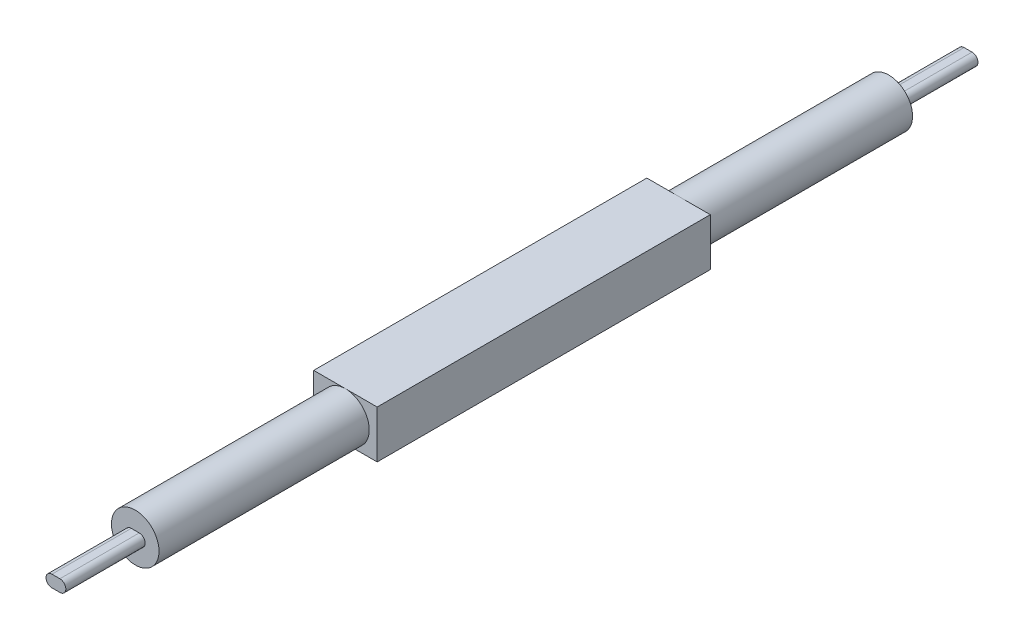
ISO-10303-21;
HEADER;
FILE_DESCRIPTION(('STEP AP214'),'2;1');
FILE_NAME('part.step','',(''),(''),'','','');
FILE_SCHEMA(('AUTOMOTIVE_DESIGN { 1 0 10303 214 1 1 1 1 }'));
ENDSEC;
DATA;
#1=APPLICATION_CONTEXT('core data for automotive mechanical design processes');
#2=APPLICATION_PROTOCOL_DEFINITION('international standard','automotive_design',2000,#1);
#3=PRODUCT_CONTEXT('',#1,'mechanical');
#4=PRODUCT('Part','Part','',(#3));
#5=PRODUCT_RELATED_PRODUCT_CATEGORY('part','',(#4));
#6=PRODUCT_DEFINITION_FORMATION('','',#4);
#7=PRODUCT_DEFINITION_CONTEXT('part definition',#1,'design');
#8=PRODUCT_DEFINITION('design','',#6,#7);
#9=PRODUCT_DEFINITION_SHAPE('','',#8);
#10=(LENGTH_UNIT() NAMED_UNIT(*) SI_UNIT(.MILLI.,.METRE.));
#11=(NAMED_UNIT(*) PLANE_ANGLE_UNIT() SI_UNIT($,.RADIAN.));
#12=(NAMED_UNIT(*) SI_UNIT($,.STERADIAN.) SOLID_ANGLE_UNIT());
#13=UNCERTAINTY_MEASURE_WITH_UNIT(LENGTH_MEASURE(1.E-05),#10,'distance_accuracy_value','');
#14=(GEOMETRIC_REPRESENTATION_CONTEXT(3) GLOBAL_UNCERTAINTY_ASSIGNED_CONTEXT((#13)) GLOBAL_UNIT_ASSIGNED_CONTEXT((#10,
#11,#12)) REPRESENTATION_CONTEXT('',''));
#15=CARTESIAN_POINT('',(0.,0.,0.));
#16=DIRECTION('',(0.,0.,1.));
#17=DIRECTION('',(1.,0.,0.));
#18=AXIS2_PLACEMENT_3D('',#15,#16,#17);
#19=CARTESIAN_POINT('',(0.,0.,190.));
#20=DIRECTION('',(0.,0.,-1.));
#21=DIRECTION('',(-1.,0.,0.));
#22=AXIS2_PLACEMENT_3D('',#19,#20,#21);
#23=CYLINDRICAL_SURFACE('',#22,6.);
#24=CARTESIAN_POINT('',(0.,0.,190.));
#25=DIRECTION('',(0.,0.,1.));
#26=DIRECTION('',(1.,0.,0.));
#27=AXIS2_PLACEMENT_3D('',#24,#25,#26);
#28=CIRCLE('',#27,6.);
#29=CARTESIAN_POINT('',(6.,0.,190.));
#30=VERTEX_POINT('',#29);
#31=EDGE_CURVE('E288',#30,#30,#28,.T.);
#32=ORIENTED_EDGE('',*,*,#31,.F.);
#33=EDGE_LOOP('',(#32));
#34=FACE_BOUND('',#33,.T.);
#35=CARTESIAN_POINT('',(0.,0.,137.));
#36=DIRECTION('',(0.,0.,1.));
#37=DIRECTION('',(1.,0.,0.));
#38=AXIS2_PLACEMENT_3D('',#35,#36,#37);
#39=CIRCLE('',#38,6.);
#40=CARTESIAN_POINT('',(0.,-6.,137.));
#41=VERTEX_POINT('',#40);
#42=CARTESIAN_POINT('',(0.,6.,137.));
#43=VERTEX_POINT('',#42);
#44=EDGE_CURVE('E43',#41,#43,#39,.T.);
#45=ORIENTED_EDGE('',*,*,#44,.T.);
#46=EDGE_CURVE('E11',#43,#41,#39,.T.);
#47=ORIENTED_EDGE('',*,*,#46,.T.);
#48=EDGE_LOOP('',(#45,#47));
#49=FACE_BOUND('',#48,.T.);
#50=ADVANCED_FACE('F39',(#34,#49),#23,.T.);
#51=CARTESIAN_POINT('',(0.,0.,190.));
#52=DIRECTION('',(0.,0.,1.));
#53=DIRECTION('',(1.,0.,0.));
#54=AXIS2_PLACEMENT_3D('',#51,#52,#53);
#55=PLANE('',#54);
#56=CARTESIAN_POINT('',(-1.,0.,190.));
#57=DIRECTION('',(0.,0.,1.));
#58=DIRECTION('',(1.,0.,0.));
#59=AXIS2_PLACEMENT_3D('',#56,#57,#58);
#60=CIRCLE('',#59,1.5);
#61=CARTESIAN_POINT('',(-1.,1.5,190.));
#62=VERTEX_POINT('',#61);
#63=CARTESIAN_POINT('',(-1.,-1.5,190.));
#64=VERTEX_POINT('',#63);
#65=EDGE_CURVE('E242',#62,#64,#60,.T.);
#66=ORIENTED_EDGE('',*,*,#65,.F.);
#67=DIRECTION('',(-1.,0.,0.));
#68=VECTOR('',#67,1.);
#69=CARTESIAN_POINT('',(-1.,1.5,190.));
#70=LINE('',#69,#68);
#71=CARTESIAN_POINT('',(1.,1.5,190.));
#72=VERTEX_POINT('',#71);
#73=EDGE_CURVE('E248',#72,#62,#70,.T.);
#74=ORIENTED_EDGE('',*,*,#73,.F.);
#75=CARTESIAN_POINT('',(1.,0.,190.));
#76=DIRECTION('',(0.,0.,1.));
#77=DIRECTION('',(1.,0.,0.));
#78=AXIS2_PLACEMENT_3D('',#75,#76,#77);
#79=CIRCLE('',#78,1.5);
#80=CARTESIAN_POINT('',(1.,-1.5,190.));
#81=VERTEX_POINT('',#80);
#82=EDGE_CURVE('E265',#81,#72,#79,.T.);
#83=ORIENTED_EDGE('',*,*,#82,.F.);
#84=DIRECTION('',(1.,0.,0.));
#85=VECTOR('',#84,1.);
#86=CARTESIAN_POINT('',(-1.,-1.5,190.));
#87=LINE('',#86,#85);
#88=EDGE_CURVE('E261',#64,#81,#87,.T.);
#89=ORIENTED_EDGE('',*,*,#88,.F.);
#90=EDGE_LOOP('',(#66,#74,#83,#89));
#91=FACE_BOUND('',#90,.T.);
#92=ORIENTED_EDGE('',*,*,#31,.T.);
#93=EDGE_LOOP('',(#92));
#94=FACE_BOUND('',#93,.T.);
#95=ADVANCED_FACE('F333',(#91,#94),#55,.T.);
#96=CARTESIAN_POINT('',(-1.,0.,210.));
#97=DIRECTION('',(0.,0.,-1.));
#98=DIRECTION('',(-1.,0.,0.));
#99=AXIS2_PLACEMENT_3D('',#96,#97,#98);
#100=CYLINDRICAL_SURFACE('',#99,1.5);
#101=ORIENTED_EDGE('',*,*,#65,.T.);
#102=DIRECTION('',(0.,0.,-1.));
#103=VECTOR('',#102,1.);
#104=CARTESIAN_POINT('',(-1.,-1.5,210.));
#105=LINE('',#104,#103);
#106=CARTESIAN_POINT('',(-1.,-1.5,210.));
#107=VERTEX_POINT('',#106);
#108=EDGE_CURVE('E283',#107,#64,#105,.T.);
#109=ORIENTED_EDGE('',*,*,#108,.F.);
#110=CARTESIAN_POINT('',(-1.,0.,210.));
#111=DIRECTION('',(0.,0.,1.));
#112=DIRECTION('',(1.,0.,0.));
#113=AXIS2_PLACEMENT_3D('',#110,#111,#112);
#114=CIRCLE('',#113,1.5);
#115=CARTESIAN_POINT('',(-1.,1.5,210.));
#116=VERTEX_POINT('',#115);
#117=EDGE_CURVE('E243',#116,#107,#114,.T.);
#118=ORIENTED_EDGE('',*,*,#117,.F.);
#119=DIRECTION('',(0.,0.,-1.));
#120=VECTOR('',#119,1.);
#121=CARTESIAN_POINT('',(-1.,1.5,210.));
#122=LINE('',#121,#120);
#123=EDGE_CURVE('E257',#116,#62,#122,.T.);
#124=ORIENTED_EDGE('',*,*,#123,.T.);
#125=EDGE_LOOP('',(#101,#109,#118,#124));
#126=FACE_BOUND('',#125,.T.);
#127=ADVANCED_FACE('F338',(#126),#100,.T.);
#128=CARTESIAN_POINT('',(-1.,-1.5,210.));
#129=DIRECTION('',(0.,1.,0.));
#130=DIRECTION('',(0.,0.,1.));
#131=AXIS2_PLACEMENT_3D('',#128,#129,#130);
#132=PLANE('',#131);
#133=ORIENTED_EDGE('',*,*,#88,.T.);
#134=DIRECTION('',(0.,0.,-1.));
#135=VECTOR('',#134,1.);
#136=CARTESIAN_POINT('',(1.,-1.5,210.));
#137=LINE('',#136,#135);
#138=CARTESIAN_POINT('',(1.,-1.5,210.));
#139=VERTEX_POINT('',#138);
#140=EDGE_CURVE('E279',#139,#81,#137,.T.);
#141=ORIENTED_EDGE('',*,*,#140,.F.);
#142=DIRECTION('',(1.,0.,0.));
#143=VECTOR('',#142,1.);
#144=CARTESIAN_POINT('',(-1.,-1.5,210.));
#145=LINE('',#144,#143);
#146=EDGE_CURVE('E247',#107,#139,#145,.T.);
#147=ORIENTED_EDGE('',*,*,#146,.F.);
#148=ORIENTED_EDGE('',*,*,#108,.T.);
#149=EDGE_LOOP('',(#133,#141,#147,#148));
#150=FACE_BOUND('',#149,.T.);
#151=ADVANCED_FACE('F391',(#150),#132,.F.);
#152=CARTESIAN_POINT('',(1.,0.,210.));
#153=DIRECTION('',(0.,0.,-1.));
#154=DIRECTION('',(-1.,0.,0.));
#155=AXIS2_PLACEMENT_3D('',#152,#153,#154);
#156=CYLINDRICAL_SURFACE('',#155,1.5);
#157=ORIENTED_EDGE('',*,*,#82,.T.);
#158=DIRECTION('',(0.,0.,-1.));
#159=VECTOR('',#158,1.);
#160=CARTESIAN_POINT('',(1.,1.5,210.));
#161=LINE('',#160,#159);
#162=CARTESIAN_POINT('',(1.,1.5,210.));
#163=VERTEX_POINT('',#162);
#164=EDGE_CURVE('E275',#163,#72,#161,.T.);
#165=ORIENTED_EDGE('',*,*,#164,.F.);
#166=CARTESIAN_POINT('',(1.,0.,210.));
#167=DIRECTION('',(0.,0.,1.));
#168=DIRECTION('',(1.,0.,0.));
#169=AXIS2_PLACEMENT_3D('',#166,#167,#168);
#170=CIRCLE('',#169,1.5);
#171=EDGE_CURVE('E251',#139,#163,#170,.T.);
#172=ORIENTED_EDGE('',*,*,#171,.F.);
#173=ORIENTED_EDGE('',*,*,#140,.T.);
#174=EDGE_LOOP('',(#157,#165,#172,#173));
#175=FACE_BOUND('',#174,.T.);
#176=ADVANCED_FACE('F387',(#175),#156,.T.);
#177=CARTESIAN_POINT('',(-1.,1.5,210.));
#178=DIRECTION('',(0.,-1.,0.));
#179=DIRECTION('',(0.,0.,-1.));
#180=AXIS2_PLACEMENT_3D('',#177,#178,#179);
#181=PLANE('',#180);
#182=ORIENTED_EDGE('',*,*,#73,.T.);
#183=ORIENTED_EDGE('',*,*,#123,.F.);
#184=DIRECTION('',(-1.,0.,0.));
#185=VECTOR('',#184,1.);
#186=CARTESIAN_POINT('',(-1.,1.5,210.));
#187=LINE('',#186,#185);
#188=EDGE_CURVE('E254',#163,#116,#187,.T.);
#189=ORIENTED_EDGE('',*,*,#188,.F.);
#190=ORIENTED_EDGE('',*,*,#164,.T.);
#191=EDGE_LOOP('',(#182,#183,#189,#190));
#192=FACE_BOUND('',#191,.T.);
#193=ADVANCED_FACE('F383',(#192),#181,.F.);
#194=CARTESIAN_POINT('',(-1.,0.,210.));
#195=DIRECTION('',(0.,0.,1.));
#196=DIRECTION('',(1.,0.,0.));
#197=AXIS2_PLACEMENT_3D('',#194,#195,#196);
#198=PLANE('',#197);
#199=ORIENTED_EDGE('',*,*,#117,.T.);
#200=ORIENTED_EDGE('',*,*,#146,.T.);
#201=ORIENTED_EDGE('',*,*,#171,.T.);
#202=ORIENTED_EDGE('',*,*,#188,.T.);
#203=EDGE_LOOP('',(#199,#200,#201,#202));
#204=FACE_BOUND('',#203,.T.);
#205=ADVANCED_FACE('F380',(#204),#198,.T.);
#206=CARTESIAN_POINT('',(8.,6.,137.));
#207=DIRECTION('',(0.,1.,0.));
#208=DIRECTION('',(0.,0.,1.));
#209=AXIS2_PLACEMENT_3D('',#206,#207,#208);
#210=PLANE('',#209);
#211=DIRECTION('',(-1.,0.,0.));
#212=VECTOR('',#211,1.);
#213=CARTESIAN_POINT('',(8.,6.,53.));
#214=LINE('',#213,#212);
#215=CARTESIAN_POINT('',(8.,6.,53.));
#216=VERTEX_POINT('',#215);
#217=CARTESIAN_POINT('',(0.,6.,53.));
#218=VERTEX_POINT('',#217);
#219=EDGE_CURVE('E63',#216,#218,#214,.T.);
#220=ORIENTED_EDGE('',*,*,#219,.T.);
#221=CARTESIAN_POINT('',(-8.,6.,53.));
#222=VERTEX_POINT('',#221);
#223=EDGE_CURVE('E139',#218,#222,#214,.T.);
#224=ORIENTED_EDGE('',*,*,#223,.T.);
#225=DIRECTION('',(0.,0.,-1.));
#226=VECTOR('',#225,1.);
#227=CARTESIAN_POINT('',(-8.,6.,137.));
#228=LINE('',#227,#226);
#229=CARTESIAN_POINT('',(-8.,6.,137.));
#230=VERTEX_POINT('',#229);
#231=EDGE_CURVE('E143',#230,#222,#228,.T.);
#232=ORIENTED_EDGE('',*,*,#231,.F.);
#233=DIRECTION('',(-1.,0.,0.));
#234=VECTOR('',#233,1.);
#235=CARTESIAN_POINT('',(8.,6.,137.));
#236=LINE('',#235,#234);
#237=EDGE_CURVE('E187',#43,#230,#236,.T.);
#238=ORIENTED_EDGE('',*,*,#237,.F.);
#239=CARTESIAN_POINT('',(8.,6.,137.));
#240=VERTEX_POINT('',#239);
#241=EDGE_CURVE('E55',#240,#43,#236,.T.);
#242=ORIENTED_EDGE('',*,*,#241,.F.);
#243=DIRECTION('',(0.,0.,-1.));
#244=VECTOR('',#243,1.);
#245=CARTESIAN_POINT('',(8.,6.,137.));
#246=LINE('',#245,#244);
#247=EDGE_CURVE('E171',#240,#216,#246,.T.);
#248=ORIENTED_EDGE('',*,*,#247,.T.);
#249=EDGE_LOOP('',(#220,#224,#232,#238,#242,#248));
#250=FACE_BOUND('',#249,.T.);
#251=ADVANCED_FACE('F141',(#250),#210,.T.);
#252=CARTESIAN_POINT('',(8.,-6.,137.));
#253=DIRECTION('',(0.,0.,1.));
#254=DIRECTION('',(1.,0.,0.));
#255=AXIS2_PLACEMENT_3D('',#252,#253,#254);
#256=PLANE('',#255);
#257=ORIENTED_EDGE('',*,*,#46,.F.);
#258=ORIENTED_EDGE('',*,*,#237,.T.);
#259=DIRECTION('',(0.,1.,0.));
#260=VECTOR('',#259,1.);
#261=CARTESIAN_POINT('',(-8.,-6.,137.));
#262=LINE('',#261,#260);
#263=CARTESIAN_POINT('',(-8.,-6.,137.));
#264=VERTEX_POINT('',#263);
#265=EDGE_CURVE('E163',#264,#230,#262,.T.);
#266=ORIENTED_EDGE('',*,*,#265,.F.);
#267=DIRECTION('',(-1.,0.,0.));
#268=VECTOR('',#267,1.);
#269=CARTESIAN_POINT('',(8.,-6.,137.));
#270=LINE('',#269,#268);
#271=EDGE_CURVE('E192',#41,#264,#270,.T.);
#272=ORIENTED_EDGE('',*,*,#271,.F.);
#273=EDGE_LOOP('',(#257,#258,#266,#272));
#274=FACE_BOUND('',#273,.T.);
#275=ADVANCED_FACE('F308',(#274),#256,.T.);
#276=CARTESIAN_POINT('',(8.,-6.,137.));
#277=DIRECTION('',(0.,-1.,0.));
#278=DIRECTION('',(0.,0.,-1.));
#279=AXIS2_PLACEMENT_3D('',#276,#277,#278);
#280=PLANE('',#279);
#281=DIRECTION('',(-1.,0.,0.));
#282=VECTOR('',#281,1.);
#283=CARTESIAN_POINT('',(8.,-5.99999999999995,53.));
#284=LINE('',#283,#282);
#285=CARTESIAN_POINT('',(0.,-5.99999999999995,53.));
#286=VERTEX_POINT('',#285);
#287=CARTESIAN_POINT('',(-8.,-5.99999999999995,53.));
#288=VERTEX_POINT('',#287);
#289=EDGE_CURVE('E153',#286,#288,#284,.T.);
#290=ORIENTED_EDGE('',*,*,#289,.F.);
#291=CARTESIAN_POINT('',(8.,-5.99999999999995,53.));
#292=VERTEX_POINT('',#291);
#293=EDGE_CURVE('E193',#292,#286,#284,.T.);
#294=ORIENTED_EDGE('',*,*,#293,.F.);
#295=DIRECTION('',(0.,0.,1.));
#296=VECTOR('',#295,1.);
#297=CARTESIAN_POINT('',(8.,-6.,137.));
#298=LINE('',#297,#296);
#299=CARTESIAN_POINT('',(8.,-6.,137.));
#300=VERTEX_POINT('',#299);
#301=EDGE_CURVE('E178',#292,#300,#298,.T.);
#302=ORIENTED_EDGE('',*,*,#301,.T.);
#303=EDGE_CURVE('E188',#300,#41,#270,.T.);
#304=ORIENTED_EDGE('',*,*,#303,.T.);
#305=ORIENTED_EDGE('',*,*,#271,.T.);
#306=DIRECTION('',(0.,0.,1.));
#307=VECTOR('',#306,1.);
#308=CARTESIAN_POINT('',(-8.,-6.,137.));
#309=LINE('',#308,#307);
#310=EDGE_CURVE('E158',#288,#264,#309,.T.);
#311=ORIENTED_EDGE('',*,*,#310,.F.);
#312=EDGE_LOOP('',(#290,#294,#302,#304,#305,#311));
#313=FACE_BOUND('',#312,.T.);
#314=ADVANCED_FACE('F311',(#313),#280,.T.);
#315=CARTESIAN_POINT('',(8.,-5.99999999999995,53.));
#316=DIRECTION('',(0.,0.,-1.));
#317=DIRECTION('',(-1.,0.,0.));
#318=AXIS2_PLACEMENT_3D('',#315,#316,#317);
#319=PLANE('',#318);
#320=CARTESIAN_POINT('',(0.,0.,53.));
#321=DIRECTION('',(0.,0.,-1.));
#322=DIRECTION('',(-1.,0.,0.));
#323=AXIS2_PLACEMENT_3D('',#320,#321,#322);
#324=CIRCLE('',#323,6.);
#325=EDGE_CURVE('E297',#218,#286,#324,.T.);
#326=ORIENTED_EDGE('',*,*,#325,.F.);
#327=ORIENTED_EDGE('',*,*,#219,.F.);
#328=DIRECTION('',(0.,-1.,0.));
#329=VECTOR('',#328,1.);
#330=CARTESIAN_POINT('',(8.,-5.99999999999995,53.));
#331=LINE('',#330,#329);
#332=EDGE_CURVE('E174',#216,#292,#331,.T.);
#333=ORIENTED_EDGE('',*,*,#332,.T.);
#334=ORIENTED_EDGE('',*,*,#293,.T.);
#335=EDGE_LOOP('',(#326,#327,#333,#334));
#336=FACE_BOUND('',#335,.T.);
#337=ADVANCED_FACE('F321',(#336),#319,.T.);
#338=ORIENTED_EDGE('',*,*,#44,.F.);
#339=ORIENTED_EDGE('',*,*,#303,.F.);
#340=DIRECTION('',(0.,1.,0.));
#341=VECTOR('',#340,1.);
#342=CARTESIAN_POINT('',(8.,-6.,137.));
#343=LINE('',#342,#341);
#344=EDGE_CURVE('E147',#300,#240,#343,.T.);
#345=ORIENTED_EDGE('',*,*,#344,.T.);
#346=ORIENTED_EDGE('',*,*,#241,.T.);
#347=EDGE_LOOP('',(#338,#339,#345,#346));
#348=FACE_BOUND('',#347,.T.);
#349=ADVANCED_FACE('F306',(#348),#256,.T.);
#350=EDGE_CURVE('E292',#286,#218,#324,.T.);
#351=ORIENTED_EDGE('',*,*,#350,.F.);
#352=ORIENTED_EDGE('',*,*,#289,.T.);
#353=DIRECTION('',(0.,-1.,0.));
#354=VECTOR('',#353,1.);
#355=CARTESIAN_POINT('',(-8.,-5.99999999999995,53.));
#356=LINE('',#355,#354);
#357=EDGE_CURVE('E150',#222,#288,#356,.T.);
#358=ORIENTED_EDGE('',*,*,#357,.F.);
#359=ORIENTED_EDGE('',*,*,#223,.F.);
#360=EDGE_LOOP('',(#351,#352,#358,#359));
#361=FACE_BOUND('',#360,.T.);
#362=ADVANCED_FACE('F151',(#361),#319,.T.);
#363=CARTESIAN_POINT('',(8.,0.,0.));
#364=DIRECTION('',(1.,0.,0.));
#365=DIRECTION('',(0.,0.,-1.));
#366=AXIS2_PLACEMENT_3D('',#363,#364,#365);
#367=PLANE('',#366);
#368=ORIENTED_EDGE('',*,*,#247,.F.);
#369=ORIENTED_EDGE('',*,*,#344,.F.);
#370=ORIENTED_EDGE('',*,*,#301,.F.);
#371=ORIENTED_EDGE('',*,*,#332,.F.);
#372=EDGE_LOOP('',(#368,#369,#370,#371));
#373=FACE_BOUND('',#372,.T.);
#374=ADVANCED_FACE('F317',(#373),#367,.T.);
#375=CARTESIAN_POINT('',(-8.,0.,0.));
#376=DIRECTION('',(1.,0.,0.));
#377=DIRECTION('',(0.,0.,-1.));
#378=AXIS2_PLACEMENT_3D('',#375,#376,#377);
#379=PLANE('',#378);
#380=ORIENTED_EDGE('',*,*,#231,.T.);
#381=ORIENTED_EDGE('',*,*,#357,.T.);
#382=ORIENTED_EDGE('',*,*,#310,.T.);
#383=ORIENTED_EDGE('',*,*,#265,.T.);
#384=EDGE_LOOP('',(#380,#381,#382,#383));
#385=FACE_BOUND('',#384,.T.);
#386=ADVANCED_FACE('F161',(#385),#379,.F.);
#387=CARTESIAN_POINT('',(1.,0.,-20.));
#388=DIRECTION('',(0.,0.,-1.));
#389=DIRECTION('',(-1.,0.,0.));
#390=AXIS2_PLACEMENT_3D('',#387,#388,#389);
#391=PLANE('',#390);
#392=CARTESIAN_POINT('',(1.,0.,-20.));
#393=DIRECTION('',(0.,0.,-1.));
#394=DIRECTION('',(-1.,0.,0.));
#395=AXIS2_PLACEMENT_3D('',#392,#393,#394);
#396=CIRCLE('',#395,1.5);
#397=CARTESIAN_POINT('',(1.,1.5,-20.));
#398=VERTEX_POINT('',#397);
#399=CARTESIAN_POINT('',(1.,-1.5,-20.));
#400=VERTEX_POINT('',#399);
#401=EDGE_CURVE('E198',#398,#400,#396,.T.);
#402=ORIENTED_EDGE('',*,*,#401,.T.);
#403=DIRECTION('',(-1.,0.,0.));
#404=VECTOR('',#403,1.);
#405=CARTESIAN_POINT('',(1.,-1.5,-20.));
#406=LINE('',#405,#404);
#407=CARTESIAN_POINT('',(-1.,-1.5,-20.));
#408=VERTEX_POINT('',#407);
#409=EDGE_CURVE('E202',#400,#408,#406,.T.);
#410=ORIENTED_EDGE('',*,*,#409,.T.);
#411=CARTESIAN_POINT('',(-1.,0.,-20.));
#412=DIRECTION('',(0.,0.,-1.));
#413=DIRECTION('',(-1.,0.,0.));
#414=AXIS2_PLACEMENT_3D('',#411,#412,#413);
#415=CIRCLE('',#414,1.5);
#416=CARTESIAN_POINT('',(-1.,1.5,-20.));
#417=VERTEX_POINT('',#416);
#418=EDGE_CURVE('E206',#408,#417,#415,.T.);
#419=ORIENTED_EDGE('',*,*,#418,.T.);
#420=DIRECTION('',(1.,0.,0.));
#421=VECTOR('',#420,1.);
#422=CARTESIAN_POINT('',(1.,1.5,-20.));
#423=LINE('',#422,#421);
#424=EDGE_CURVE('E209',#417,#398,#423,.T.);
#425=ORIENTED_EDGE('',*,*,#424,.T.);
#426=EDGE_LOOP('',(#402,#410,#419,#425));
#427=FACE_BOUND('',#426,.T.);
#428=ADVANCED_FACE('F361',(#427),#391,.T.);
#429=CARTESIAN_POINT('',(1.,-1.5,-20.));
#430=DIRECTION('',(0.,1.,0.));
#431=DIRECTION('',(0.,0.,1.));
#432=AXIS2_PLACEMENT_3D('',#429,#430,#431);
#433=PLANE('',#432);
#434=DIRECTION('',(-1.,0.,0.));
#435=VECTOR('',#434,1.);
#436=CARTESIAN_POINT('',(1.,-1.5,0.));
#437=LINE('',#436,#435);
#438=CARTESIAN_POINT('',(1.,-1.5,0.));
#439=VERTEX_POINT('',#438);
#440=CARTESIAN_POINT('',(-1.,-1.5,0.));
#441=VERTEX_POINT('',#440);
#442=EDGE_CURVE('E216',#439,#441,#437,.T.);
#443=ORIENTED_EDGE('',*,*,#442,.T.);
#444=DIRECTION('',(0.,0.,1.));
#445=VECTOR('',#444,1.);
#446=CARTESIAN_POINT('',(-1.,-1.5,-20.));
#447=LINE('',#446,#445);
#448=EDGE_CURVE('E234',#408,#441,#447,.T.);
#449=ORIENTED_EDGE('',*,*,#448,.F.);
#450=ORIENTED_EDGE('',*,*,#409,.F.);
#451=DIRECTION('',(0.,0.,1.));
#452=VECTOR('',#451,1.);
#453=CARTESIAN_POINT('',(1.,-1.5,-20.));
#454=LINE('',#453,#452);
#455=EDGE_CURVE('E238',#400,#439,#454,.T.);
#456=ORIENTED_EDGE('',*,*,#455,.T.);
#457=EDGE_LOOP('',(#443,#449,#450,#456));
#458=FACE_BOUND('',#457,.T.);
#459=ADVANCED_FACE('F367',(#458),#433,.F.);
#460=CARTESIAN_POINT('',(-1.,0.,-20.));
#461=DIRECTION('',(0.,0.,1.));
#462=DIRECTION('',(1.,0.,0.));
#463=AXIS2_PLACEMENT_3D('',#460,#461,#462);
#464=CYLINDRICAL_SURFACE('',#463,1.5);
#465=CARTESIAN_POINT('',(-1.,0.,0.));
#466=DIRECTION('',(0.,0.,-1.));
#467=DIRECTION('',(-1.,0.,0.));
#468=AXIS2_PLACEMENT_3D('',#465,#466,#467);
#469=CIRCLE('',#468,1.5);
#470=CARTESIAN_POINT('',(-1.,1.5,0.));
#471=VERTEX_POINT('',#470);
#472=EDGE_CURVE('E220',#441,#471,#469,.T.);
#473=ORIENTED_EDGE('',*,*,#472,.T.);
#474=DIRECTION('',(0.,0.,1.));
#475=VECTOR('',#474,1.);
#476=CARTESIAN_POINT('',(-1.,1.5,-20.));
#477=LINE('',#476,#475);
#478=EDGE_CURVE('E230',#417,#471,#477,.T.);
#479=ORIENTED_EDGE('',*,*,#478,.F.);
#480=ORIENTED_EDGE('',*,*,#418,.F.);
#481=ORIENTED_EDGE('',*,*,#448,.T.);
#482=EDGE_LOOP('',(#473,#479,#480,#481));
#483=FACE_BOUND('',#482,.T.);
#484=ADVANCED_FACE('F365',(#483),#464,.T.);
#485=CARTESIAN_POINT('',(1.,1.5,-20.));
#486=DIRECTION('',(0.,-1.,0.));
#487=DIRECTION('',(0.,0.,-1.));
#488=AXIS2_PLACEMENT_3D('',#485,#486,#487);
#489=PLANE('',#488);
#490=DIRECTION('',(1.,0.,0.));
#491=VECTOR('',#490,1.);
#492=CARTESIAN_POINT('',(1.,1.5,0.));
#493=LINE('',#492,#491);
#494=CARTESIAN_POINT('',(1.,1.5,0.));
#495=VERTEX_POINT('',#494);
#496=EDGE_CURVE('E203',#471,#495,#493,.T.);
#497=ORIENTED_EDGE('',*,*,#496,.T.);
#498=DIRECTION('',(0.,0.,1.));
#499=VECTOR('',#498,1.);
#500=CARTESIAN_POINT('',(1.,1.5,-20.));
#501=LINE('',#500,#499);
#502=EDGE_CURVE('E212',#398,#495,#501,.T.);
#503=ORIENTED_EDGE('',*,*,#502,.F.);
#504=ORIENTED_EDGE('',*,*,#424,.F.);
#505=ORIENTED_EDGE('',*,*,#478,.T.);
#506=EDGE_LOOP('',(#497,#503,#504,#505));
#507=FACE_BOUND('',#506,.T.);
#508=ADVANCED_FACE('F356',(#507),#489,.F.);
#509=CARTESIAN_POINT('',(1.,0.,-20.));
#510=DIRECTION('',(0.,0.,1.));
#511=DIRECTION('',(1.,0.,0.));
#512=AXIS2_PLACEMENT_3D('',#509,#510,#511);
#513=CYLINDRICAL_SURFACE('',#512,1.5);
#514=CARTESIAN_POINT('',(1.,0.,0.));
#515=DIRECTION('',(0.,0.,-1.));
#516=DIRECTION('',(-1.,0.,0.));
#517=AXIS2_PLACEMENT_3D('',#514,#515,#516);
#518=CIRCLE('',#517,1.5);
#519=EDGE_CURVE('E186',#495,#439,#518,.T.);
#520=ORIENTED_EDGE('',*,*,#519,.T.);
#521=ORIENTED_EDGE('',*,*,#455,.F.);
#522=ORIENTED_EDGE('',*,*,#401,.F.);
#523=ORIENTED_EDGE('',*,*,#502,.T.);
#524=EDGE_LOOP('',(#520,#521,#522,#523));
#525=FACE_BOUND('',#524,.T.);
#526=ADVANCED_FACE('F347',(#525),#513,.T.);
#527=CARTESIAN_POINT('',(0.,0.,0.));
#528=DIRECTION('',(0.,0.,1.));
#529=DIRECTION('',(1.,0.,0.));
#530=AXIS2_PLACEMENT_3D('',#527,#528,#529);
#531=PLANE('',#530);
#532=CARTESIAN_POINT('',(0.,0.,0.));
#533=DIRECTION('',(0.,0.,1.));
#534=DIRECTION('',(1.,0.,0.));
#535=AXIS2_PLACEMENT_3D('',#532,#533,#534);
#536=CIRCLE('',#535,6.);
#537=CARTESIAN_POINT('',(6.,0.,0.));
#538=VERTEX_POINT('',#537);
#539=EDGE_CURVE('E287',#538,#538,#536,.T.);
#540=ORIENTED_EDGE('',*,*,#539,.F.);
#541=EDGE_LOOP('',(#540));
#542=FACE_BOUND('',#541,.T.);
#543=ORIENTED_EDGE('',*,*,#519,.F.);
#544=ORIENTED_EDGE('',*,*,#496,.F.);
#545=ORIENTED_EDGE('',*,*,#472,.F.);
#546=ORIENTED_EDGE('',*,*,#442,.F.);
#547=EDGE_LOOP('',(#543,#544,#545,#546));
#548=FACE_BOUND('',#547,.T.);
#549=ADVANCED_FACE('F343',(#542,#548),#531,.F.);
#550=ORIENTED_EDGE('',*,*,#350,.T.);
#551=ORIENTED_EDGE('',*,*,#325,.T.);
#552=EDGE_LOOP('',(#550,#551));
#553=FACE_BOUND('',#552,.T.);
#554=ORIENTED_EDGE('',*,*,#539,.T.);
#555=EDGE_LOOP('',(#554));
#556=FACE_BOUND('',#555,.T.);
#557=ADVANCED_FACE('F41',(#553,#556),#23,.T.);
#558=CLOSED_SHELL('',(#50,#95,#127,#151,#176,#193,#205,#251,#275,#314,#337,#349,#362,#374,#386,
#428,#459,#484,#508,#526,#549,#557));
#559=MANIFOLD_SOLID_BREP('B2',#558);
#560=ADVANCED_BREP_SHAPE_REPRESENTATION('',(#18,#559),#14);
#561=SHAPE_DEFINITION_REPRESENTATION(#9,#560);
ENDSEC;
END-ISO-10303-21;
